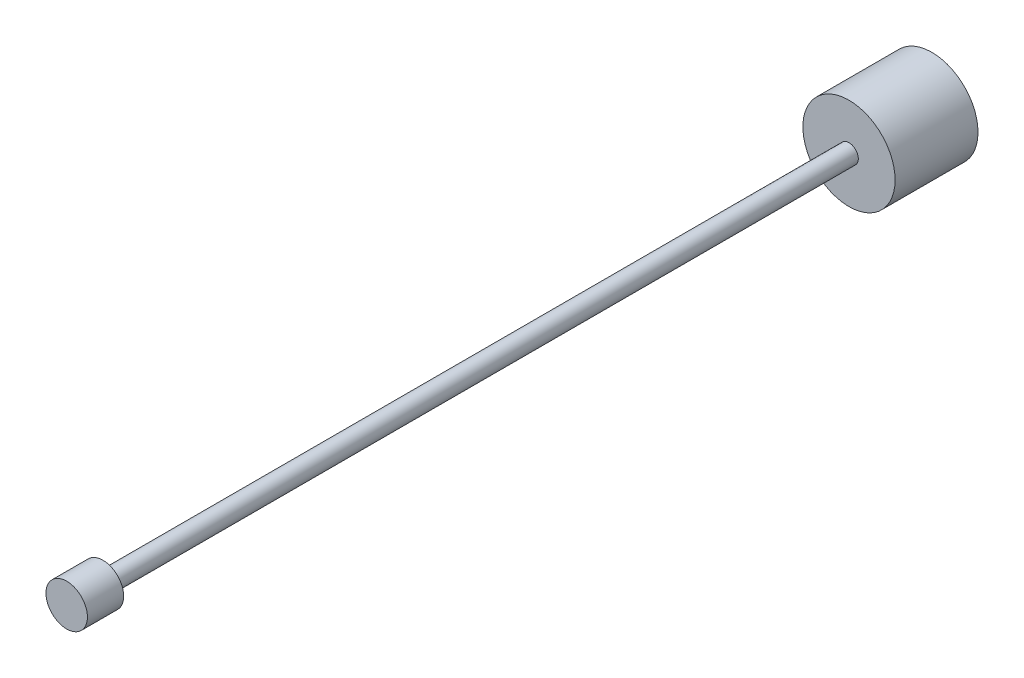
ISO-10303-21;
HEADER;
FILE_DESCRIPTION(('STEP AP214'),'2;1');
FILE_NAME('part.step','',(''),(''),'','','');
FILE_SCHEMA(('AUTOMOTIVE_DESIGN { 1 0 10303 214 1 1 1 1 }'));
ENDSEC;
DATA;
#1=APPLICATION_CONTEXT('core data for automotive mechanical design processes');
#2=APPLICATION_PROTOCOL_DEFINITION('international standard','automotive_design',2000,#1);
#3=PRODUCT_CONTEXT('',#1,'mechanical');
#4=PRODUCT('Part','Part','',(#3));
#5=PRODUCT_RELATED_PRODUCT_CATEGORY('part','',(#4));
#6=PRODUCT_DEFINITION_FORMATION('','',#4);
#7=PRODUCT_DEFINITION_CONTEXT('part definition',#1,'design');
#8=PRODUCT_DEFINITION('design','',#6,#7);
#9=PRODUCT_DEFINITION_SHAPE('','',#8);
#10=(LENGTH_UNIT() NAMED_UNIT(*) SI_UNIT(.MILLI.,.METRE.));
#11=(NAMED_UNIT(*) PLANE_ANGLE_UNIT() SI_UNIT($,.RADIAN.));
#12=(NAMED_UNIT(*) SI_UNIT($,.STERADIAN.) SOLID_ANGLE_UNIT());
#13=UNCERTAINTY_MEASURE_WITH_UNIT(LENGTH_MEASURE(1.E-05),#10,'distance_accuracy_value','');
#14=(GEOMETRIC_REPRESENTATION_CONTEXT(3) GLOBAL_UNCERTAINTY_ASSIGNED_CONTEXT((#13)) GLOBAL_UNIT_ASSIGNED_CONTEXT((#10,
#11,#12)) REPRESENTATION_CONTEXT('',''));
#15=CARTESIAN_POINT('',(0.,0.,0.));
#16=DIRECTION('',(0.,0.,1.));
#17=DIRECTION('',(1.,0.,0.));
#18=AXIS2_PLACEMENT_3D('',#15,#16,#17);
#19=CARTESIAN_POINT('',(0.,0.,160.));
#20=DIRECTION('',(0.,0.,-1.));
#21=DIRECTION('',(-1.,0.,0.));
#22=AXIS2_PLACEMENT_3D('',#19,#20,#21);
#23=CYLINDRICAL_SURFACE('',#22,1.8);
#24=CARTESIAN_POINT('',(0.,0.,160.));
#25=DIRECTION('',(0.,0.,1.));
#26=DIRECTION('',(1.,0.,0.));
#27=AXIS2_PLACEMENT_3D('',#24,#25,#26);
#28=CIRCLE('',#27,1.8);
#29=CARTESIAN_POINT('',(1.8,0.,160.));
#30=VERTEX_POINT('',#29);
#31=EDGE_CURVE('E11',#30,#30,#28,.T.);
#32=ORIENTED_EDGE('',*,*,#31,.F.);
#33=EDGE_LOOP('',(#32));
#34=FACE_BOUND('',#33,.T.);
#35=CARTESIAN_POINT('',(0.,0.,16.));
#36=DIRECTION('',(0.,0.,1.));
#37=DIRECTION('',(1.,0.,0.));
#38=AXIS2_PLACEMENT_3D('',#35,#36,#37);
#39=CIRCLE('',#38,1.8);
#40=CARTESIAN_POINT('',(1.8,0.,16.));
#41=VERTEX_POINT('',#40);
#42=EDGE_CURVE('E53',#41,#41,#39,.T.);
#43=ORIENTED_EDGE('',*,*,#42,.T.);
#44=EDGE_LOOP('',(#43));
#45=FACE_BOUND('',#44,.T.);
#46=ADVANCED_FACE('F51',(#34,#45),#23,.T.);
#47=CARTESIAN_POINT('',(0.,0.,16.));
#48=DIRECTION('',(0.,0.,1.));
#49=DIRECTION('',(1.,0.,0.));
#50=AXIS2_PLACEMENT_3D('',#47,#48,#49);
#51=PLANE('',#50);
#52=ORIENTED_EDGE('',*,*,#42,.F.);
#53=EDGE_LOOP('',(#52));
#54=FACE_BOUND('',#53,.T.);
#55=ADVANCED_FACE('F74',(#54),#51,.F.);
#56=CARTESIAN_POINT('',(0.,0.,167.));
#57=DIRECTION('',(0.,0.,-1.));
#58=DIRECTION('',(-1.,0.,0.));
#59=AXIS2_PLACEMENT_3D('',#56,#57,#58);
#60=CYLINDRICAL_SURFACE('',#59,4.);
#61=CARTESIAN_POINT('',(0.,0.,167.));
#62=DIRECTION('',(0.,0.,1.));
#63=DIRECTION('',(1.,0.,0.));
#64=AXIS2_PLACEMENT_3D('',#61,#62,#63);
#65=CIRCLE('',#64,4.);
#66=CARTESIAN_POINT('',(4.,0.,167.));
#67=VERTEX_POINT('',#66);
#68=EDGE_CURVE('E62',#67,#67,#65,.T.);
#69=ORIENTED_EDGE('',*,*,#68,.F.);
#70=EDGE_LOOP('',(#69));
#71=FACE_BOUND('',#70,.T.);
#72=CARTESIAN_POINT('',(0.,0.,160.));
#73=DIRECTION('',(0.,0.,1.));
#74=DIRECTION('',(1.,0.,0.));
#75=AXIS2_PLACEMENT_3D('',#72,#73,#74);
#76=CIRCLE('',#75,4.);
#77=CARTESIAN_POINT('',(4.,0.,160.));
#78=VERTEX_POINT('',#77);
#79=EDGE_CURVE('E64',#78,#78,#76,.T.);
#80=ORIENTED_EDGE('',*,*,#79,.T.);
#81=EDGE_LOOP('',(#80));
#82=FACE_BOUND('',#81,.T.);
#83=ADVANCED_FACE('F72',(#71,#82),#60,.T.);
#84=CARTESIAN_POINT('',(0.,0.,167.));
#85=DIRECTION('',(0.,0.,1.));
#86=DIRECTION('',(1.,0.,0.));
#87=AXIS2_PLACEMENT_3D('',#84,#85,#86);
#88=PLANE('',#87);
#89=ORIENTED_EDGE('',*,*,#68,.T.);
#90=EDGE_LOOP('',(#89));
#91=FACE_BOUND('',#90,.T.);
#92=ADVANCED_FACE('F67',(#91),#88,.T.);
#93=CARTESIAN_POINT('',(0.,0.,160.));
#94=DIRECTION('',(0.,0.,1.));
#95=DIRECTION('',(1.,0.,0.));
#96=AXIS2_PLACEMENT_3D('',#93,#94,#95);
#97=PLANE('',#96);
#98=ORIENTED_EDGE('',*,*,#31,.T.);
#99=EDGE_LOOP('',(#98));
#100=FACE_BOUND('',#99,.T.);
#101=ORIENTED_EDGE('',*,*,#79,.F.);
#102=EDGE_LOOP('',(#101));
#103=FACE_BOUND('',#102,.T.);
#104=ADVANCED_FACE('F79',(#100,#103),#97,.F.);
#105=CLOSED_SHELL('',(#46,#55,#83,#92,#104));
#106=MANIFOLD_SOLID_BREP('B2',#105);
#107=CARTESIAN_POINT('',(0.,0.,16.));
#108=DIRECTION('',(0.,0.,-1.));
#109=DIRECTION('',(-1.,0.,0.));
#110=AXIS2_PLACEMENT_3D('',#107,#108,#109);
#111=CYLINDRICAL_SURFACE('',#110,8.9);
#112=CARTESIAN_POINT('',(0.,0.,16.));
#113=DIRECTION('',(0.,0.,1.));
#114=DIRECTION('',(1.,0.,0.));
#115=AXIS2_PLACEMENT_3D('',#112,#113,#114);
#116=CIRCLE('',#115,8.9);
#117=CARTESIAN_POINT('',(8.9,0.,16.));
#118=VERTEX_POINT('',#117);
#119=EDGE_CURVE('E49',#118,#118,#116,.T.);
#120=ORIENTED_EDGE('',*,*,#119,.F.);
#121=EDGE_LOOP('',(#120));
#122=FACE_BOUND('',#121,.T.);
#123=CARTESIAN_POINT('',(0.,0.,0.));
#124=DIRECTION('',(0.,0.,1.));
#125=DIRECTION('',(1.,0.,0.));
#126=AXIS2_PLACEMENT_3D('',#123,#124,#125);
#127=CIRCLE('',#126,8.9);
#128=CARTESIAN_POINT('',(8.9,0.,0.));
#129=VERTEX_POINT('',#128);
#130=EDGE_CURVE('E124',#129,#129,#127,.T.);
#131=ORIENTED_EDGE('',*,*,#130,.T.);
#132=EDGE_LOOP('',(#131));
#133=FACE_BOUND('',#132,.T.);
#134=ADVANCED_FACE('F125',(#122,#133),#111,.T.);
#135=CARTESIAN_POINT('',(0.,0.,16.));
#136=DIRECTION('',(0.,0.,1.));
#137=DIRECTION('',(1.,0.,0.));
#138=AXIS2_PLACEMENT_3D('',#135,#136,#137);
#139=PLANE('',#138);
#140=ORIENTED_EDGE('',*,*,#119,.T.);
#141=EDGE_LOOP('',(#140));
#142=FACE_BOUND('',#141,.T.);
#143=ADVANCED_FACE('F137',(#142),#139,.T.);
#144=CARTESIAN_POINT('',(0.,0.,0.));
#145=DIRECTION('',(0.,0.,1.));
#146=DIRECTION('',(1.,0.,0.));
#147=AXIS2_PLACEMENT_3D('',#144,#145,#146);
#148=PLANE('',#147);
#149=ORIENTED_EDGE('',*,*,#130,.F.);
#150=EDGE_LOOP('',(#149));
#151=FACE_BOUND('',#150,.T.);
#152=ADVANCED_FACE('F140',(#151),#148,.F.);
#153=CLOSED_SHELL('',(#134,#143,#152));
#154=MANIFOLD_SOLID_BREP('B6',#153);
#155=ADVANCED_BREP_SHAPE_REPRESENTATION('',(#18,#106,#154),#14);
#156=SHAPE_DEFINITION_REPRESENTATION(#9,#155);
ENDSEC;
END-ISO-10303-21;
